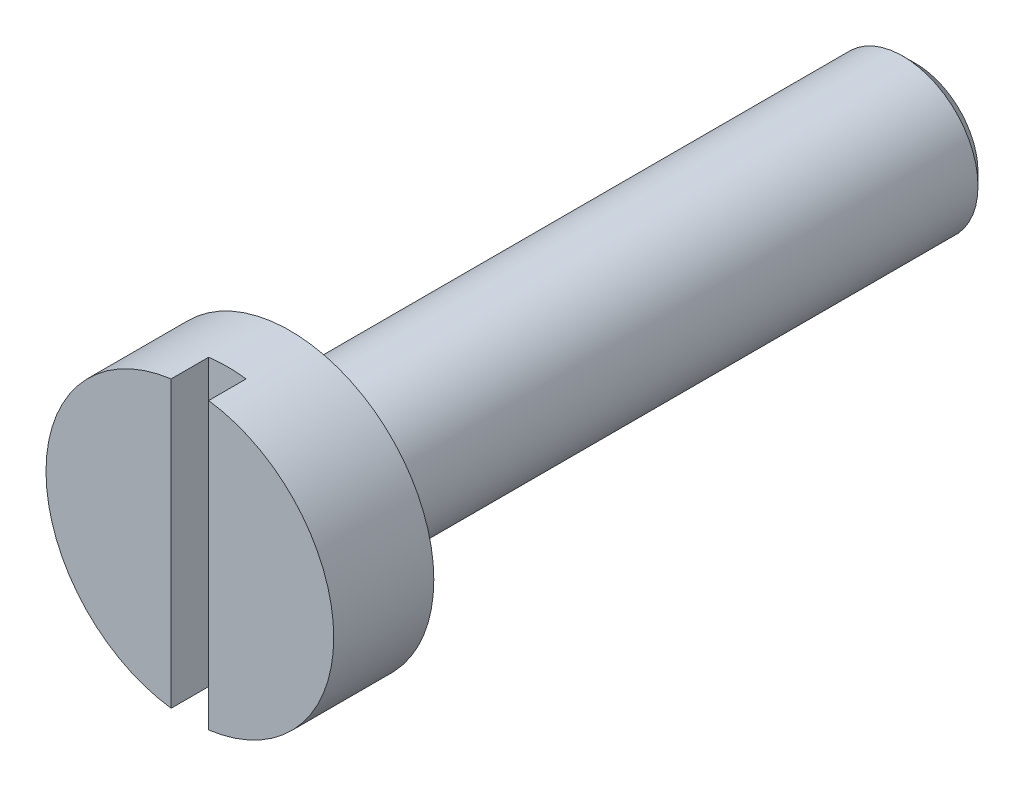
ISO-10303-21;
HEADER;
FILE_DESCRIPTION(('STEP AP214'),'2;1');
FILE_NAME('part.step','',(''),(''),'','','');
FILE_SCHEMA(('AUTOMOTIVE_DESIGN { 1 0 10303 214 1 1 1 1 }'));
ENDSEC;
DATA;
#1=APPLICATION_CONTEXT('core data for automotive mechanical design processes');
#2=APPLICATION_PROTOCOL_DEFINITION('international standard','automotive_design',2000,#1);
#3=PRODUCT_CONTEXT('',#1,'mechanical');
#4=PRODUCT('Part','Part','',(#3));
#5=PRODUCT_RELATED_PRODUCT_CATEGORY('part','',(#4));
#6=PRODUCT_DEFINITION_FORMATION('','',#4);
#7=PRODUCT_DEFINITION_CONTEXT('part definition',#1,'design');
#8=PRODUCT_DEFINITION('design','',#6,#7);
#9=PRODUCT_DEFINITION_SHAPE('','',#8);
#10=(LENGTH_UNIT() NAMED_UNIT(*) SI_UNIT(.MILLI.,.METRE.));
#11=(NAMED_UNIT(*) PLANE_ANGLE_UNIT() SI_UNIT($,.RADIAN.));
#12=(NAMED_UNIT(*) SI_UNIT($,.STERADIAN.) SOLID_ANGLE_UNIT());
#13=UNCERTAINTY_MEASURE_WITH_UNIT(LENGTH_MEASURE(1.E-05),#10,'distance_accuracy_value','');
#14=(GEOMETRIC_REPRESENTATION_CONTEXT(3) GLOBAL_UNCERTAINTY_ASSIGNED_CONTEXT((#13)) GLOBAL_UNIT_ASSIGNED_CONTEXT((#10,
#11,#12)) REPRESENTATION_CONTEXT('',''));
#15=CARTESIAN_POINT('',(0.,0.,0.));
#16=DIRECTION('',(0.,0.,1.));
#17=DIRECTION('',(1.,0.,0.));
#18=AXIS2_PLACEMENT_3D('',#15,#16,#17);
#19=CARTESIAN_POINT('',(0.,0.,0.8));
#20=DIRECTION('',(0.,0.,1.));
#21=DIRECTION('',(1.,0.,0.));
#22=AXIS2_PLACEMENT_3D('',#19,#20,#21);
#23=PLANE('',#22);
#24=DIRECTION('',(0.,-1.,0.));
#25=VECTOR('',#24,1.);
#26=CARTESIAN_POINT('',(-0.15,0.,0.8));
#27=LINE('',#26,#25);
#28=CARTESIAN_POINT('',(-0.15,1.14017542509914,0.8));
#29=VERTEX_POINT('',#28);
#30=CARTESIAN_POINT('',(-0.15,-1.14017542509914,0.8));
#31=VERTEX_POINT('',#30);
#32=EDGE_CURVE('E82',#29,#31,#27,.T.);
#33=ORIENTED_EDGE('',*,*,#32,.F.);
#34=CARTESIAN_POINT('',(0.,0.,0.8));
#35=DIRECTION('',(0.,0.,1.));
#36=DIRECTION('',(1.,0.,0.));
#37=AXIS2_PLACEMENT_3D('',#34,#35,#36);
#38=CIRCLE('',#37,1.15);
#39=EDGE_CURVE('E95',#29,#31,#38,.T.);
#40=ORIENTED_EDGE('',*,*,#39,.T.);
#41=EDGE_LOOP('',(#33,#40));
#42=FACE_BOUND('',#41,.T.);
#43=ADVANCED_FACE('F35',(#42),#23,.T.);
#44=CARTESIAN_POINT('',(0.,0.,0.8));
#45=DIRECTION('',(0.,0.,-1.));
#46=DIRECTION('',(-1.,0.,0.));
#47=AXIS2_PLACEMENT_3D('',#44,#45,#46);
#48=CYLINDRICAL_SURFACE('',#47,1.15);
#49=ORIENTED_EDGE('',*,*,#39,.F.);
#50=DIRECTION('',(0.,0.,-1.));
#51=VECTOR('',#50,1.);
#52=CARTESIAN_POINT('',(-0.15,1.14017542509914,0.8));
#53=LINE('',#52,#51);
#54=CARTESIAN_POINT('',(-0.15,1.14017542509914,0.5));
#55=VERTEX_POINT('',#54);
#56=EDGE_CURVE('E116',#29,#55,#53,.T.);
#57=ORIENTED_EDGE('',*,*,#56,.T.);
#58=CARTESIAN_POINT('',(0.,0.,0.5));
#59=DIRECTION('',(0.,0.,1.));
#60=DIRECTION('',(1.,0.,0.));
#61=AXIS2_PLACEMENT_3D('',#58,#59,#60);
#62=CIRCLE('',#61,1.15);
#63=CARTESIAN_POINT('',(0.15,1.14017542509914,0.5));
#64=VERTEX_POINT('',#63);
#65=EDGE_CURVE('E11',#64,#55,#62,.T.);
#66=ORIENTED_EDGE('',*,*,#65,.F.);
#67=DIRECTION('',(0.,0.,-1.));
#68=VECTOR('',#67,1.);
#69=CARTESIAN_POINT('',(0.15,1.14017542509914,0.8));
#70=LINE('',#69,#68);
#71=CARTESIAN_POINT('',(0.15,1.14017542509914,0.8));
#72=VERTEX_POINT('',#71);
#73=EDGE_CURVE('E77',#64,#72,#70,.F.);
#74=ORIENTED_EDGE('',*,*,#73,.T.);
#75=CARTESIAN_POINT('',(0.15,-1.14017542509914,0.8));
#76=VERTEX_POINT('',#75);
#77=EDGE_CURVE('E90',#76,#72,#38,.T.);
#78=ORIENTED_EDGE('',*,*,#77,.F.);
#79=DIRECTION('',(0.,0.,-1.));
#80=VECTOR('',#79,1.);
#81=CARTESIAN_POINT('',(0.15,-1.14017542509914,0.8));
#82=LINE('',#81,#80);
#83=CARTESIAN_POINT('',(0.15,-1.14017542509914,0.5));
#84=VERTEX_POINT('',#83);
#85=EDGE_CURVE('E50',#76,#84,#82,.T.);
#86=ORIENTED_EDGE('',*,*,#85,.T.);
#87=CARTESIAN_POINT('',(-0.15,-1.14017542509914,0.5));
#88=VERTEX_POINT('',#87);
#89=EDGE_CURVE('E39',#88,#84,#62,.T.);
#90=ORIENTED_EDGE('',*,*,#89,.F.);
#91=DIRECTION('',(0.,0.,-1.));
#92=VECTOR('',#91,1.);
#93=CARTESIAN_POINT('',(-0.15,-1.14017542509914,0.8));
#94=LINE('',#93,#92);
#95=EDGE_CURVE('E58',#88,#31,#94,.F.);
#96=ORIENTED_EDGE('',*,*,#95,.T.);
#97=EDGE_LOOP('',(#49,#57,#66,#74,#78,#86,#90,#96));
#98=FACE_BOUND('',#97,.T.);
#99=CARTESIAN_POINT('',(0.,0.,0.));
#100=DIRECTION('',(0.,0.,1.));
#101=DIRECTION('',(1.,0.,0.));
#102=AXIS2_PLACEMENT_3D('',#99,#100,#101);
#103=CIRCLE('',#102,1.15);
#104=CARTESIAN_POINT('',(1.15,0.,0.));
#105=VERTEX_POINT('',#104);
#106=EDGE_CURVE('E96',#105,#105,#103,.T.);
#107=ORIENTED_EDGE('',*,*,#106,.T.);
#108=EDGE_LOOP('',(#107));
#109=FACE_BOUND('',#108,.T.);
#110=ADVANCED_FACE('F88',(#98,#109),#48,.T.);
#111=DIRECTION('',(0.,1.,0.));
#112=VECTOR('',#111,1.);
#113=CARTESIAN_POINT('',(0.15,0.,0.8));
#114=LINE('',#113,#112);
#115=EDGE_CURVE('E74',#76,#72,#114,.T.);
#116=ORIENTED_EDGE('',*,*,#115,.F.);
#117=ORIENTED_EDGE('',*,*,#77,.T.);
#118=EDGE_LOOP('',(#116,#117));
#119=FACE_BOUND('',#118,.T.);
#120=ADVANCED_FACE('F94',(#119),#23,.T.);
#121=CARTESIAN_POINT('',(0.,0.,0.));
#122=DIRECTION('',(0.,0.,1.));
#123=DIRECTION('',(1.,0.,0.));
#124=AXIS2_PLACEMENT_3D('',#121,#122,#123);
#125=PLANE('',#124);
#126=CARTESIAN_POINT('',(0.,0.,0.));
#127=DIRECTION('',(0.,0.,1.));
#128=DIRECTION('',(1.,0.,0.));
#129=AXIS2_PLACEMENT_3D('',#126,#127,#128);
#130=CIRCLE('',#129,0.6);
#131=CARTESIAN_POINT('',(0.6,0.,0.));
#132=VERTEX_POINT('',#131);
#133=EDGE_CURVE('E101',#132,#132,#130,.T.);
#134=ORIENTED_EDGE('',*,*,#133,.T.);
#135=EDGE_LOOP('',(#134));
#136=FACE_BOUND('',#135,.T.);
#137=ORIENTED_EDGE('',*,*,#106,.F.);
#138=EDGE_LOOP('',(#137));
#139=FACE_BOUND('',#138,.T.);
#140=ADVANCED_FACE('F121',(#136,#139),#125,.F.);
#141=CARTESIAN_POINT('',(0.,0.,-5.));
#142=DIRECTION('',(0.,0.,1.));
#143=DIRECTION('',(1.,0.,0.));
#144=AXIS2_PLACEMENT_3D('',#141,#142,#143);
#145=CYLINDRICAL_SURFACE('',#144,0.6);
#146=CARTESIAN_POINT('',(0.,0.,-4.9));
#147=DIRECTION('',(0.,0.,1.));
#148=DIRECTION('',(1.,0.,0.));
#149=AXIS2_PLACEMENT_3D('',#146,#147,#148);
#150=CIRCLE('',#149,0.6);
#151=CARTESIAN_POINT('',(0.6,0.,-4.9));
#152=VERTEX_POINT('',#151);
#153=EDGE_CURVE('E99',#152,#152,#150,.T.);
#154=ORIENTED_EDGE('',*,*,#153,.T.);
#155=EDGE_LOOP('',(#154));
#156=FACE_BOUND('',#155,.T.);
#157=ORIENTED_EDGE('',*,*,#133,.F.);
#158=EDGE_LOOP('',(#157));
#159=FACE_BOUND('',#158,.T.);
#160=ADVANCED_FACE('F124',(#156,#159),#145,.T.);
#161=CARTESIAN_POINT('',(0.,0.,-5.));
#162=DIRECTION('',(0.,0.,1.));
#163=DIRECTION('',(1.,0.,0.));
#164=AXIS2_PLACEMENT_3D('',#161,#162,#163);
#165=PLANE('',#164);
#166=CARTESIAN_POINT('',(0.,0.,-5.));
#167=DIRECTION('',(0.,0.,1.));
#168=DIRECTION('',(1.,0.,0.));
#169=AXIS2_PLACEMENT_3D('',#166,#167,#168);
#170=CIRCLE('',#169,0.5);
#171=CARTESIAN_POINT('',(0.5,0.,-5.));
#172=VERTEX_POINT('',#171);
#173=EDGE_CURVE('E83',#172,#172,#170,.F.);
#174=ORIENTED_EDGE('',*,*,#173,.T.);
#175=EDGE_LOOP('',(#174));
#176=FACE_BOUND('',#175,.T.);
#177=ADVANCED_FACE('F126',(#176),#165,.F.);
#178=CARTESIAN_POINT('',(0.,0.,-4.9));
#179=DIRECTION('',(0.,0.,1.));
#180=DIRECTION('',(1.,0.,0.));
#181=AXIS2_PLACEMENT_3D('',#178,#179,#180);
#182=CONICAL_SURFACE('',#181,0.6,0.785398163397449);
#183=ORIENTED_EDGE('',*,*,#173,.F.);
#184=EDGE_LOOP('',(#183));
#185=FACE_BOUND('',#184,.T.);
#186=ORIENTED_EDGE('',*,*,#153,.F.);
#187=EDGE_LOOP('',(#186));
#188=FACE_BOUND('',#187,.T.);
#189=ADVANCED_FACE('F37',(#185,#188),#182,.T.);
#190=CARTESIAN_POINT('',(0.,0.,0.5));
#191=DIRECTION('',(0.,0.,1.));
#192=DIRECTION('',(1.,0.,0.));
#193=AXIS2_PLACEMENT_3D('',#190,#191,#192);
#194=PLANE('',#193);
#195=ORIENTED_EDGE('',*,*,#65,.T.);
#196=DIRECTION('',(0.,-1.,0.));
#197=VECTOR('',#196,1.);
#198=CARTESIAN_POINT('',(-0.15,-1.19461020399294,0.5));
#199=LINE('',#198,#197);
#200=EDGE_CURVE('E113',#55,#88,#199,.T.);
#201=ORIENTED_EDGE('',*,*,#200,.T.);
#202=ORIENTED_EDGE('',*,*,#89,.T.);
#203=DIRECTION('',(0.,1.,0.));
#204=VECTOR('',#203,1.);
#205=CARTESIAN_POINT('',(0.15,-1.19461020399294,0.5));
#206=LINE('',#205,#204);
#207=EDGE_CURVE('E92',#84,#64,#206,.T.);
#208=ORIENTED_EDGE('',*,*,#207,.T.);
#209=EDGE_LOOP('',(#195,#201,#202,#208));
#210=FACE_BOUND('',#209,.T.);
#211=ADVANCED_FACE('F112',(#210),#194,.T.);
#212=CARTESIAN_POINT('',(-0.15,-1.19461020399294,0.5));
#213=DIRECTION('',(-1.,0.,0.));
#214=DIRECTION('',(0.,0.,1.));
#215=AXIS2_PLACEMENT_3D('',#212,#213,#214);
#216=PLANE('',#215);
#217=ORIENTED_EDGE('',*,*,#32,.T.);
#218=ORIENTED_EDGE('',*,*,#95,.F.);
#219=ORIENTED_EDGE('',*,*,#200,.F.);
#220=ORIENTED_EDGE('',*,*,#56,.F.);
#221=EDGE_LOOP('',(#217,#218,#219,#220));
#222=FACE_BOUND('',#221,.T.);
#223=ADVANCED_FACE('F189',(#222),#216,.F.);
#224=CARTESIAN_POINT('',(0.15,-1.19461020399294,0.5));
#225=DIRECTION('',(1.,0.,0.));
#226=DIRECTION('',(0.,0.,-1.));
#227=AXIS2_PLACEMENT_3D('',#224,#225,#226);
#228=PLANE('',#227);
#229=ORIENTED_EDGE('',*,*,#115,.T.);
#230=ORIENTED_EDGE('',*,*,#73,.F.);
#231=ORIENTED_EDGE('',*,*,#207,.F.);
#232=ORIENTED_EDGE('',*,*,#85,.F.);
#233=EDGE_LOOP('',(#229,#230,#231,#232));
#234=FACE_BOUND('',#233,.T.);
#235=ADVANCED_FACE('F76',(#234),#228,.F.);
#236=CLOSED_SHELL('',(#43,#110,#120,#140,#160,#177,#189,#211,#223,#235));
#237=MANIFOLD_SOLID_BREP('B2',#236);
#238=ADVANCED_BREP_SHAPE_REPRESENTATION('',(#18,#237),#14);
#239=SHAPE_DEFINITION_REPRESENTATION(#9,#238);
ENDSEC;
END-ISO-10303-21;
